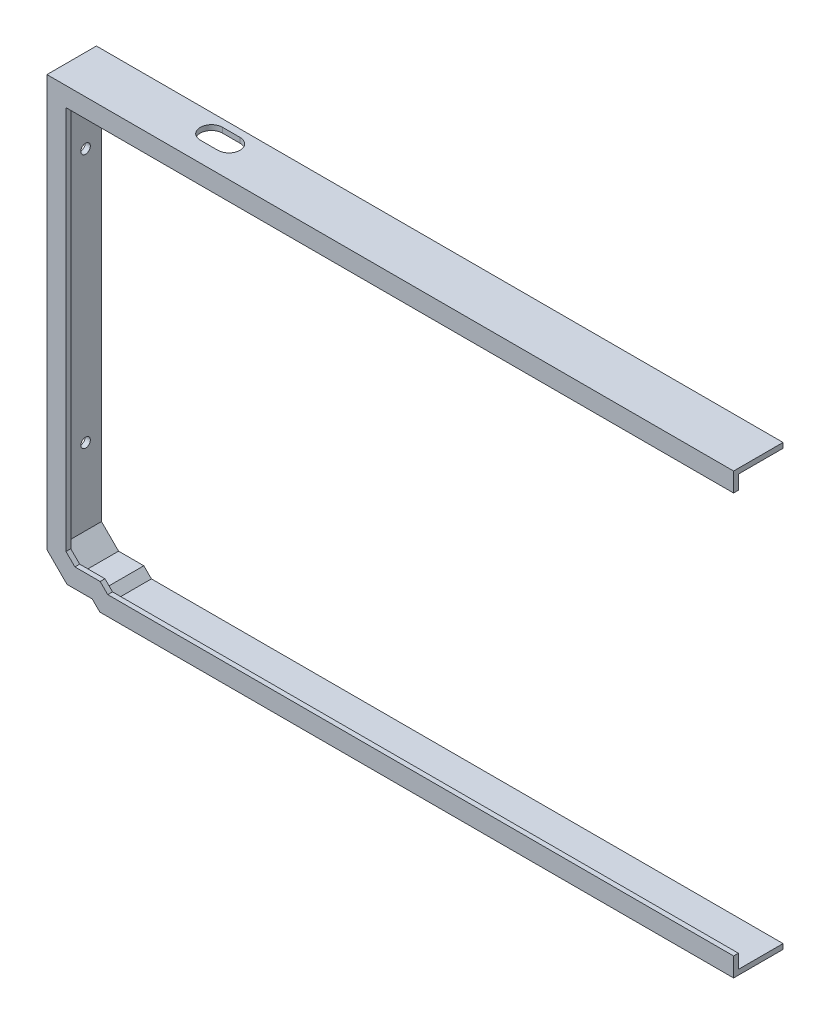
ISO-10303-21;
HEADER;
FILE_DESCRIPTION(('STEP AP214'),'2;1');
FILE_NAME('part.step','',(''),(''),'','','');
FILE_SCHEMA(('AUTOMOTIVE_DESIGN { 1 0 10303 214 1 1 1 1 }'));
ENDSEC;
DATA;
#1=APPLICATION_CONTEXT('core data for automotive mechanical design processes');
#2=APPLICATION_PROTOCOL_DEFINITION('international standard','automotive_design',2000,#1);
#3=PRODUCT_CONTEXT('',#1,'mechanical');
#4=PRODUCT('Part','Part','',(#3));
#5=PRODUCT_RELATED_PRODUCT_CATEGORY('part','',(#4));
#6=PRODUCT_DEFINITION_FORMATION('','',#4);
#7=PRODUCT_DEFINITION_CONTEXT('part definition',#1,'design');
#8=PRODUCT_DEFINITION('design','',#6,#7);
#9=PRODUCT_DEFINITION_SHAPE('','',#8);
#10=(LENGTH_UNIT() NAMED_UNIT(*) SI_UNIT(.MILLI.,.METRE.));
#11=(NAMED_UNIT(*) PLANE_ANGLE_UNIT() SI_UNIT($,.RADIAN.));
#12=(NAMED_UNIT(*) SI_UNIT($,.STERADIAN.) SOLID_ANGLE_UNIT());
#13=UNCERTAINTY_MEASURE_WITH_UNIT(LENGTH_MEASURE(1.E-05),#10,'distance_accuracy_value','');
#14=(GEOMETRIC_REPRESENTATION_CONTEXT(3) GLOBAL_UNCERTAINTY_ASSIGNED_CONTEXT((#13)) GLOBAL_UNIT_ASSIGNED_CONTEXT((#10,
#11,#12)) REPRESENTATION_CONTEXT('',''));
#15=CARTESIAN_POINT('',(0.,0.,0.));
#16=DIRECTION('',(0.,0.,1.));
#17=DIRECTION('',(1.,0.,0.));
#18=AXIS2_PLACEMENT_3D('',#15,#16,#17);
#19=CARTESIAN_POINT('',(-1.7,1.7,-14.05));
#20=DIRECTION('',(-1.,0.,0.));
#21=DIRECTION('',(0.,0.,1.));
#22=AXIS2_PLACEMENT_3D('',#19,#20,#21);
#23=PLANE('',#22);
#24=CARTESIAN_POINT('',(-1.7,-22.9620815280171,-9.05000000000001));
#25=DIRECTION('',(-1.,0.,0.));
#26=DIRECTION('',(0.,0.,1.));
#27=AXIS2_PLACEMENT_3D('',#24,#25,#26);
#28=CIRCLE('',#27,1.5);
#29=CARTESIAN_POINT('',(-1.7,-22.9620815280171,-7.55000000000001));
#30=VERTEX_POINT('',#29);
#31=EDGE_CURVE('E398',#30,#30,#28,.T.);
#32=ORIENTED_EDGE('',*,*,#31,.F.);
#33=EDGE_LOOP('',(#32));
#34=FACE_BOUND('',#33,.T.);
#35=CARTESIAN_POINT('',(-1.7,-102.962081528017,-9.05000000000001));
#36=DIRECTION('',(-1.,0.,0.));
#37=DIRECTION('',(0.,0.,1.));
#38=AXIS2_PLACEMENT_3D('',#35,#36,#37);
#39=CIRCLE('',#38,1.5);
#40=CARTESIAN_POINT('',(-1.7,-102.962081528017,-7.55000000000001));
#41=VERTEX_POINT('',#40);
#42=EDGE_CURVE('E399',#41,#41,#39,.T.);
#43=ORIENTED_EDGE('',*,*,#42,.F.);
#44=EDGE_LOOP('',(#43));
#45=FACE_BOUND('',#44,.T.);
#46=DIRECTION('',(0.,0.,1.));
#47=VECTOR('',#46,1.);
#48=CARTESIAN_POINT('',(-1.7,-127.624163056034,-14.05));
#49=LINE('',#48,#47);
#50=CARTESIAN_POINT('',(-1.7,-127.624163056034,-14.05));
#51=VERTEX_POINT('',#50);
#52=CARTESIAN_POINT('',(-1.7,-127.624163056034,1.5));
#53=VERTEX_POINT('',#52);
#54=EDGE_CURVE('E296',#51,#53,#49,.T.);
#55=ORIENTED_EDGE('',*,*,#54,.T.);
#56=DIRECTION('',(0.,-1.,0.));
#57=VECTOR('',#56,1.);
#58=CARTESIAN_POINT('',(-1.7,1.7,1.5));
#59=LINE('',#58,#57);
#60=CARTESIAN_POINT('',(-1.7,1.7,1.5));
#61=VERTEX_POINT('',#60);
#62=EDGE_CURVE('E308',#61,#53,#59,.T.);
#63=ORIENTED_EDGE('',*,*,#62,.F.);
#64=DIRECTION('',(0.,0.,1.));
#65=VECTOR('',#64,1.);
#66=CARTESIAN_POINT('',(-1.7,1.7,-14.05));
#67=LINE('',#66,#65);
#68=CARTESIAN_POINT('',(-1.7,1.7,-14.05));
#69=VERTEX_POINT('',#68);
#70=EDGE_CURVE('E46',#69,#61,#67,.T.);
#71=ORIENTED_EDGE('',*,*,#70,.F.);
#72=DIRECTION('',(0.,-1.,0.));
#73=VECTOR('',#72,1.);
#74=CARTESIAN_POINT('',(-1.7,1.7,-14.05));
#75=LINE('',#74,#73);
#76=EDGE_CURVE('E270',#69,#51,#75,.T.);
#77=ORIENTED_EDGE('',*,*,#76,.T.);
#78=EDGE_LOOP('',(#55,#63,#71,#77));
#79=FACE_BOUND('',#78,.T.);
#80=ADVANCED_FACE('F39',(#34,#45,#79),#23,.T.);
#81=CARTESIAN_POINT('',(-1.7,1.7,-14.05));
#82=DIRECTION('',(0.,1.,0.));
#83=DIRECTION('',(0.,0.,1.));
#84=AXIS2_PLACEMENT_3D('',#81,#82,#83);
#85=PLANE('',#84);
#86=DIRECTION('',(0.,0.,1.));
#87=VECTOR('',#86,1.);
#88=CARTESIAN_POINT('',(214.14,1.7,1.5));
#89=LINE('',#88,#87);
#90=CARTESIAN_POINT('',(214.14,1.7,-14.05));
#91=VERTEX_POINT('',#90);
#92=CARTESIAN_POINT('',(214.14,1.7,1.5));
#93=VERTEX_POINT('',#92);
#94=EDGE_CURVE('E220',#91,#93,#89,.T.);
#95=ORIENTED_EDGE('',*,*,#94,.F.);
#96=DIRECTION('',(-1.,0.,0.));
#97=VECTOR('',#96,1.);
#98=CARTESIAN_POINT('',(-1.7,1.7,-14.05));
#99=LINE('',#98,#97);
#100=EDGE_CURVE('E294',#91,#69,#99,.T.);
#101=ORIENTED_EDGE('',*,*,#100,.T.);
#102=ORIENTED_EDGE('',*,*,#70,.T.);
#103=DIRECTION('',(-1.,0.,0.));
#104=VECTOR('',#103,1.);
#105=CARTESIAN_POINT('',(429.98,1.7,1.5));
#106=LINE('',#105,#104);
#107=EDGE_CURVE('E317',#93,#61,#106,.T.);
#108=ORIENTED_EDGE('',*,*,#107,.F.);
#109=EDGE_LOOP('',(#95,#101,#102,#108));
#110=FACE_BOUND('',#109,.T.);
#111=CARTESIAN_POINT('',(45.76,1.7,-8.25));
#112=DIRECTION('',(0.,1.,0.));
#113=DIRECTION('',(0.,0.,1.));
#114=AXIS2_PLACEMENT_3D('',#111,#112,#113);
#115=CIRCLE('',#114,3.5);
#116=CARTESIAN_POINT('',(45.76,1.7,-4.75));
#117=VERTEX_POINT('',#116);
#118=CARTESIAN_POINT('',(45.76,1.7,-11.75));
#119=VERTEX_POINT('',#118);
#120=EDGE_CURVE('E385',#117,#119,#115,.T.);
#121=ORIENTED_EDGE('',*,*,#120,.F.);
#122=DIRECTION('',(1.,0.,0.));
#123=VECTOR('',#122,1.);
#124=CARTESIAN_POINT('',(45.76,1.7,-4.75));
#125=LINE('',#124,#123);
#126=CARTESIAN_POINT('',(40.26,1.7,-4.75));
#127=VERTEX_POINT('',#126);
#128=EDGE_CURVE('E370',#127,#117,#125,.T.);
#129=ORIENTED_EDGE('',*,*,#128,.F.);
#130=CARTESIAN_POINT('',(40.26,1.7,-8.25));
#131=DIRECTION('',(0.,1.,0.));
#132=DIRECTION('',(0.,0.,1.));
#133=AXIS2_PLACEMENT_3D('',#130,#131,#132);
#134=CIRCLE('',#133,3.5);
#135=CARTESIAN_POINT('',(40.26,1.7,-11.75));
#136=VERTEX_POINT('',#135);
#137=EDGE_CURVE('E379',#136,#127,#134,.T.);
#138=ORIENTED_EDGE('',*,*,#137,.F.);
#139=DIRECTION('',(-1.,0.,0.));
#140=VECTOR('',#139,1.);
#141=CARTESIAN_POINT('',(45.76,1.7,-11.75));
#142=LINE('',#141,#140);
#143=EDGE_CURVE('E382',#119,#136,#142,.T.);
#144=ORIENTED_EDGE('',*,*,#143,.F.);
#145=EDGE_LOOP('',(#121,#129,#138,#144));
#146=FACE_BOUND('',#145,.T.);
#147=ADVANCED_FACE('F423',(#110,#146),#85,.T.);
#148=CARTESIAN_POINT('',(413.350841276725,-136.31332177931,-14.05));
#149=DIRECTION('',(0.,-1.,0.));
#150=DIRECTION('',(0.,0.,-1.));
#151=AXIS2_PLACEMENT_3D('',#148,#149,#150);
#152=PLANE('',#151);
#153=DIRECTION('',(0.,0.,1.));
#154=VECTOR('',#153,1.);
#155=CARTESIAN_POINT('',(214.14,-136.31332177931,1.5));
#156=LINE('',#155,#154);
#157=CARTESIAN_POINT('',(214.14,-136.31332177931,-14.05));
#158=VERTEX_POINT('',#157);
#159=CARTESIAN_POINT('',(214.14,-136.31332177931,1.5));
#160=VERTEX_POINT('',#159);
#161=EDGE_CURVE('E205',#158,#160,#156,.T.);
#162=ORIENTED_EDGE('',*,*,#161,.T.);
#163=DIRECTION('',(1.,0.,0.));
#164=VECTOR('',#163,1.);
#165=CARTESIAN_POINT('',(14.9291587232754,-136.31332177931,1.5));
#166=LINE('',#165,#164);
#167=CARTESIAN_POINT('',(14.9291587232754,-136.31332177931,1.5));
#168=VERTEX_POINT('',#167);
#169=EDGE_CURVE('E217',#168,#160,#166,.T.);
#170=ORIENTED_EDGE('',*,*,#169,.F.);
#171=DIRECTION('',(0.,0.,1.));
#172=VECTOR('',#171,1.);
#173=CARTESIAN_POINT('',(14.9291587232754,-136.31332177931,-14.05));
#174=LINE('',#173,#172);
#175=CARTESIAN_POINT('',(14.9291587232754,-136.31332177931,-14.05));
#176=VERTEX_POINT('',#175);
#177=EDGE_CURVE('E299',#176,#168,#174,.T.);
#178=ORIENTED_EDGE('',*,*,#177,.F.);
#179=DIRECTION('',(1.,0.,0.));
#180=VECTOR('',#179,1.);
#181=CARTESIAN_POINT('',(413.350841276725,-136.31332177931,-14.05));
#182=LINE('',#181,#180);
#183=EDGE_CURVE('E219',#176,#158,#182,.T.);
#184=ORIENTED_EDGE('',*,*,#183,.T.);
#185=EDGE_LOOP('',(#162,#170,#178,#184));
#186=FACE_BOUND('',#185,.T.);
#187=ADVANCED_FACE('F216',(#186),#152,.T.);
#188=CARTESIAN_POINT('',(12.5462088706767,-133.930371926711,-14.05));
#189=DIRECTION('',(-0.707106781186547,-0.707106781186547,0.));
#190=DIRECTION('',(0.707106781186548,-0.707106781186548,0.));
#191=AXIS2_PLACEMENT_3D('',#188,#189,#190);
#192=PLANE('',#191);
#193=ORIENTED_EDGE('',*,*,#177,.T.);
#194=DIRECTION('',(0.707106781186547,-0.707106781186547,0.));
#195=VECTOR('',#194,1.);
#196=CARTESIAN_POINT('',(12.5462088706767,-133.930371926711,1.5));
#197=LINE('',#196,#195);
#198=CARTESIAN_POINT('',(12.5462088706767,-133.930371926711,1.5));
#199=VERTEX_POINT('',#198);
#200=EDGE_CURVE('E226',#199,#168,#197,.T.);
#201=ORIENTED_EDGE('',*,*,#200,.F.);
#202=DIRECTION('',(0.,0.,1.));
#203=VECTOR('',#202,1.);
#204=CARTESIAN_POINT('',(12.5462088706767,-133.930371926711,-14.05));
#205=LINE('',#204,#203);
#206=CARTESIAN_POINT('',(12.5462088706767,-133.930371926711,-14.05));
#207=VERTEX_POINT('',#206);
#208=EDGE_CURVE('E301',#207,#199,#205,.T.);
#209=ORIENTED_EDGE('',*,*,#208,.F.);
#210=DIRECTION('',(0.707106781186547,-0.707106781186547,0.));
#211=VECTOR('',#210,1.);
#212=CARTESIAN_POINT('',(12.5462088706767,-133.930371926711,-14.05));
#213=LINE('',#212,#211);
#214=EDGE_CURVE('E290',#207,#176,#213,.T.);
#215=ORIENTED_EDGE('',*,*,#214,.T.);
#216=EDGE_LOOP('',(#193,#201,#209,#215));
#217=FACE_BOUND('',#216,.T.);
#218=ADVANCED_FACE('F432',(#217),#192,.T.);
#219=CARTESIAN_POINT('',(4.60620887067671,-133.930371926711,-14.05));
#220=DIRECTION('',(0.,-1.,0.));
#221=DIRECTION('',(0.,0.,-1.));
#222=AXIS2_PLACEMENT_3D('',#219,#220,#221);
#223=PLANE('',#222);
#224=ORIENTED_EDGE('',*,*,#208,.T.);
#225=DIRECTION('',(1.,0.,0.));
#226=VECTOR('',#225,1.);
#227=CARTESIAN_POINT('',(4.60620887067671,-133.930371926711,1.5));
#228=LINE('',#227,#226);
#229=CARTESIAN_POINT('',(4.60620887067671,-133.930371926711,1.5));
#230=VERTEX_POINT('',#229);
#231=EDGE_CURVE('E232',#230,#199,#228,.T.);
#232=ORIENTED_EDGE('',*,*,#231,.F.);
#233=DIRECTION('',(0.,0.,1.));
#234=VECTOR('',#233,1.);
#235=CARTESIAN_POINT('',(4.60620887067671,-133.930371926711,-14.05));
#236=LINE('',#235,#234);
#237=CARTESIAN_POINT('',(4.60620887067671,-133.930371926711,-14.05));
#238=VERTEX_POINT('',#237);
#239=EDGE_CURVE('E303',#238,#230,#236,.T.);
#240=ORIENTED_EDGE('',*,*,#239,.F.);
#241=DIRECTION('',(1.,0.,0.));
#242=VECTOR('',#241,1.);
#243=CARTESIAN_POINT('',(4.60620887067671,-133.930371926711,-14.05));
#244=LINE('',#243,#242);
#245=EDGE_CURVE('E287',#238,#207,#244,.T.);
#246=ORIENTED_EDGE('',*,*,#245,.T.);
#247=EDGE_LOOP('',(#224,#232,#240,#246));
#248=FACE_BOUND('',#247,.T.);
#249=ADVANCED_FACE('F430',(#248),#223,.T.);
#250=CARTESIAN_POINT('',(-1.7,-127.624163056034,-14.05));
#251=DIRECTION('',(-0.707106781186547,-0.707106781186548,0.));
#252=DIRECTION('',(0.707106781186548,-0.707106781186547,0.));
#253=AXIS2_PLACEMENT_3D('',#250,#251,#252);
#254=PLANE('',#253);
#255=ORIENTED_EDGE('',*,*,#239,.T.);
#256=DIRECTION('',(0.707106781186548,-0.707106781186547,0.));
#257=VECTOR('',#256,1.);
#258=CARTESIAN_POINT('',(-1.7,-127.624163056034,1.5));
#259=LINE('',#258,#257);
#260=EDGE_CURVE('E314',#53,#230,#259,.T.);
#261=ORIENTED_EDGE('',*,*,#260,.F.);
#262=ORIENTED_EDGE('',*,*,#54,.F.);
#263=DIRECTION('',(0.707106781186548,-0.707106781186547,0.));
#264=VECTOR('',#263,1.);
#265=CARTESIAN_POINT('',(-1.7,-127.624163056034,-14.05));
#266=LINE('',#265,#264);
#267=EDGE_CURVE('E284',#51,#238,#266,.T.);
#268=ORIENTED_EDGE('',*,*,#267,.T.);
#269=EDGE_LOOP('',(#255,#261,#262,#268));
#270=FACE_BOUND('',#269,.T.);
#271=ADVANCED_FACE('F319',(#270),#254,.T.);
#272=CARTESIAN_POINT('',(0.,0.,-14.05));
#273=DIRECTION('',(0.,0.,1.));
#274=DIRECTION('',(1.,0.,0.));
#275=AXIS2_PLACEMENT_3D('',#272,#273,#274);
#276=PLANE('',#275);
#277=ORIENTED_EDGE('',*,*,#100,.F.);
#278=DIRECTION('',(0.,1.,0.));
#279=VECTOR('',#278,1.);
#280=CARTESIAN_POINT('',(214.14,-136.31332177931,-14.05));
#281=LINE('',#280,#279);
#282=CARTESIAN_POINT('',(214.14,0.099999999999989,-14.05));
#283=VERTEX_POINT('',#282);
#284=EDGE_CURVE('E211',#283,#91,#281,.T.);
#285=ORIENTED_EDGE('',*,*,#284,.F.);
#286=DIRECTION('',(-1.,0.,0.));
#287=VECTOR('',#286,1.);
#288=CARTESIAN_POINT('',(-0.1,0.1,-14.05));
#289=LINE('',#288,#287);
#290=CARTESIAN_POINT('',(-0.1,0.1,-14.05));
#291=VERTEX_POINT('',#290);
#292=EDGE_CURVE('E252',#283,#291,#289,.T.);
#293=ORIENTED_EDGE('',*,*,#292,.T.);
#294=DIRECTION('',(0.,-1.,0.));
#295=VECTOR('',#294,1.);
#296=CARTESIAN_POINT('',(-0.1,0.1,-14.05));
#297=LINE('',#296,#295);
#298=CARTESIAN_POINT('',(-0.1,-126.961421356237,-14.05));
#299=VERTEX_POINT('',#298);
#300=EDGE_CURVE('E236',#291,#299,#297,.T.);
#301=ORIENTED_EDGE('',*,*,#300,.T.);
#302=DIRECTION('',(0.707106781186547,-0.707106781186548,0.));
#303=VECTOR('',#302,1.);
#304=CARTESIAN_POINT('',(-0.1,-126.961421356237,-14.05));
#305=LINE('',#304,#303);
#306=CARTESIAN_POINT('',(5.26895057047365,-132.330371926711,-14.05));
#307=VERTEX_POINT('',#306);
#308=EDGE_CURVE('E239',#299,#307,#305,.T.);
#309=ORIENTED_EDGE('',*,*,#308,.T.);
#310=DIRECTION('',(1.,0.,0.));
#311=VECTOR('',#310,1.);
#312=CARTESIAN_POINT('',(5.26895057047367,-132.330371926711,-14.05));
#313=LINE('',#312,#311);
#314=CARTESIAN_POINT('',(13.2089505704737,-132.330371926711,-14.05));
#315=VERTEX_POINT('',#314);
#316=EDGE_CURVE('E243',#307,#315,#313,.T.);
#317=ORIENTED_EDGE('',*,*,#316,.T.);
#318=DIRECTION('',(0.707106781186547,-0.707106781186547,0.));
#319=VECTOR('',#318,1.);
#320=CARTESIAN_POINT('',(13.2089505704737,-132.330371926711,-14.05));
#321=LINE('',#320,#319);
#322=CARTESIAN_POINT('',(15.5919004230724,-134.71332177931,-14.05));
#323=VERTEX_POINT('',#322);
#324=EDGE_CURVE('E246',#315,#323,#321,.T.);
#325=ORIENTED_EDGE('',*,*,#324,.T.);
#326=DIRECTION('',(1.,0.,0.));
#327=VECTOR('',#326,1.);
#328=CARTESIAN_POINT('',(412.688099576928,-134.71332177931,-14.05));
#329=LINE('',#328,#327);
#330=CARTESIAN_POINT('',(214.14,-134.71332177931,-14.05));
#331=VERTEX_POINT('',#330);
#332=EDGE_CURVE('E249',#323,#331,#329,.T.);
#333=ORIENTED_EDGE('',*,*,#332,.T.);
#334=EDGE_CURVE('E413',#158,#331,#281,.T.);
#335=ORIENTED_EDGE('',*,*,#334,.F.);
#336=ORIENTED_EDGE('',*,*,#183,.F.);
#337=ORIENTED_EDGE('',*,*,#214,.F.);
#338=ORIENTED_EDGE('',*,*,#245,.F.);
#339=ORIENTED_EDGE('',*,*,#267,.F.);
#340=ORIENTED_EDGE('',*,*,#76,.F.);
#341=EDGE_LOOP('',(#277,#285,#293,#301,#309,#317,#325,#333,#335,#336,#337,#338,#339,#340));
#342=FACE_BOUND('',#341,.T.);
#343=ADVANCED_FACE('F426',(#342),#276,.F.);
#344=CARTESIAN_POINT('',(-0.1,0.1,-14.05));
#345=DIRECTION('',(-1.,0.,0.));
#346=DIRECTION('',(0.,0.,1.));
#347=AXIS2_PLACEMENT_3D('',#344,#345,#346);
#348=PLANE('',#347);
#349=CARTESIAN_POINT('',(-0.099999999999989,-22.9620815280171,-9.05000000000001));
#350=DIRECTION('',(-1.,0.,0.));
#351=DIRECTION('',(0.,0.,1.));
#352=AXIS2_PLACEMENT_3D('',#349,#350,#351);
#353=CIRCLE('',#352,1.5);
#354=CARTESIAN_POINT('',(-0.099999999999989,-22.9620815280171,-7.55000000000001));
#355=VERTEX_POINT('',#354);
#356=EDGE_CURVE('E387',#355,#355,#353,.T.);
#357=ORIENTED_EDGE('',*,*,#356,.T.);
#358=EDGE_LOOP('',(#357));
#359=FACE_BOUND('',#358,.T.);
#360=CARTESIAN_POINT('',(-0.099999999999989,-102.962081528017,-9.05000000000001));
#361=DIRECTION('',(-1.,0.,0.));
#362=DIRECTION('',(0.,0.,1.));
#363=AXIS2_PLACEMENT_3D('',#360,#361,#362);
#364=CIRCLE('',#363,1.5);
#365=CARTESIAN_POINT('',(-0.099999999999989,-102.962081528017,-7.55000000000001));
#366=VERTEX_POINT('',#365);
#367=EDGE_CURVE('E395',#366,#366,#364,.T.);
#368=ORIENTED_EDGE('',*,*,#367,.T.);
#369=EDGE_LOOP('',(#368));
#370=FACE_BOUND('',#369,.T.);
#371=DIRECTION('',(0.,-1.,0.));
#372=VECTOR('',#371,1.);
#373=CARTESIAN_POINT('',(-0.1,0.1,0.));
#374=LINE('',#373,#372);
#375=CARTESIAN_POINT('',(-0.1,0.1,0.));
#376=VERTEX_POINT('',#375);
#377=CARTESIAN_POINT('',(-0.100000000000003,-126.961421356237,0.));
#378=VERTEX_POINT('',#377);
#379=EDGE_CURVE('E227',#376,#378,#374,.T.);
#380=ORIENTED_EDGE('',*,*,#379,.T.);
#381=DIRECTION('',(0.,0.,1.));
#382=VECTOR('',#381,1.);
#383=CARTESIAN_POINT('',(-0.1,-126.961421356237,-14.05));
#384=LINE('',#383,#382);
#385=EDGE_CURVE('E253',#299,#378,#384,.T.);
#386=ORIENTED_EDGE('',*,*,#385,.F.);
#387=ORIENTED_EDGE('',*,*,#300,.F.);
#388=DIRECTION('',(0.,0.,1.));
#389=VECTOR('',#388,1.);
#390=CARTESIAN_POINT('',(-0.1,0.1,-14.05));
#391=LINE('',#390,#389);
#392=EDGE_CURVE('E267',#291,#376,#391,.T.);
#393=ORIENTED_EDGE('',*,*,#392,.T.);
#394=EDGE_LOOP('',(#380,#386,#387,#393));
#395=FACE_BOUND('',#394,.T.);
#396=ADVANCED_FACE('F474',(#359,#370,#395),#348,.F.);
#397=CARTESIAN_POINT('',(-0.1,0.1,-14.05));
#398=DIRECTION('',(0.,1.,0.));
#399=DIRECTION('',(0.,0.,1.));
#400=AXIS2_PLACEMENT_3D('',#397,#398,#399);
#401=PLANE('',#400);
#402=DIRECTION('',(-1.,0.,0.));
#403=VECTOR('',#402,1.);
#404=CARTESIAN_POINT('',(45.76,0.0999999999999994,-4.75));
#405=LINE('',#404,#403);
#406=CARTESIAN_POINT('',(45.76,0.0999999999999994,-4.75));
#407=VERTEX_POINT('',#406);
#408=CARTESIAN_POINT('',(40.26,0.0999999999999994,-4.75));
#409=VERTEX_POINT('',#408);
#410=EDGE_CURVE('E389',#407,#409,#405,.T.);
#411=ORIENTED_EDGE('',*,*,#410,.F.);
#412=CARTESIAN_POINT('',(45.76,0.0999999999999994,-8.25));
#413=DIRECTION('',(0.,1.,0.));
#414=DIRECTION('',(0.,0.,1.));
#415=AXIS2_PLACEMENT_3D('',#412,#413,#414);
#416=CIRCLE('',#415,3.5);
#417=CARTESIAN_POINT('',(45.76,0.0999999999999994,-11.75));
#418=VERTEX_POINT('',#417);
#419=EDGE_CURVE('E365',#418,#407,#416,.F.);
#420=ORIENTED_EDGE('',*,*,#419,.F.);
#421=DIRECTION('',(1.,0.,0.));
#422=VECTOR('',#421,1.);
#423=CARTESIAN_POINT('',(45.76,0.0999999999999994,-11.75));
#424=LINE('',#423,#422);
#425=CARTESIAN_POINT('',(40.26,0.1,-11.75));
#426=VERTEX_POINT('',#425);
#427=EDGE_CURVE('E353',#426,#418,#424,.T.);
#428=ORIENTED_EDGE('',*,*,#427,.F.);
#429=CARTESIAN_POINT('',(40.26,0.0999999999999994,-8.25));
#430=DIRECTION('',(0.,1.,0.));
#431=DIRECTION('',(0.,0.,1.));
#432=AXIS2_PLACEMENT_3D('',#429,#430,#431);
#433=CIRCLE('',#432,3.5);
#434=EDGE_CURVE('E376',#409,#426,#433,.F.);
#435=ORIENTED_EDGE('',*,*,#434,.F.);
#436=EDGE_LOOP('',(#411,#420,#428,#435));
#437=FACE_BOUND('',#436,.T.);
#438=ORIENTED_EDGE('',*,*,#292,.F.);
#439=DIRECTION('',(0.,0.,1.));
#440=VECTOR('',#439,1.);
#441=CARTESIAN_POINT('',(214.14,0.1,-14.05));
#442=LINE('',#441,#440);
#443=CARTESIAN_POINT('',(214.14,0.1,0.));
#444=VERTEX_POINT('',#443);
#445=EDGE_CURVE('E402',#283,#444,#442,.T.);
#446=ORIENTED_EDGE('',*,*,#445,.T.);
#447=DIRECTION('',(-1.,0.,0.));
#448=VECTOR('',#447,1.);
#449=CARTESIAN_POINT('',(-0.1,0.1,0.));
#450=LINE('',#449,#448);
#451=EDGE_CURVE('E240',#444,#376,#450,.T.);
#452=ORIENTED_EDGE('',*,*,#451,.T.);
#453=ORIENTED_EDGE('',*,*,#392,.F.);
#454=EDGE_LOOP('',(#438,#446,#452,#453));
#455=FACE_BOUND('',#454,.T.);
#456=ADVANCED_FACE('F470',(#437,#455),#401,.F.);
#457=CARTESIAN_POINT('',(412.688099576928,-134.71332177931,-14.05));
#458=DIRECTION('',(0.,-1.,0.));
#459=DIRECTION('',(0.,0.,-1.));
#460=AXIS2_PLACEMENT_3D('',#457,#458,#459);
#461=PLANE('',#460);
#462=DIRECTION('',(1.,0.,0.));
#463=VECTOR('',#462,1.);
#464=CARTESIAN_POINT('',(412.688099576928,-134.71332177931,0.));
#465=LINE('',#464,#463);
#466=CARTESIAN_POINT('',(15.5919004230724,-134.71332177931,0.));
#467=VERTEX_POINT('',#466);
#468=CARTESIAN_POINT('',(214.14,-134.71332177931,0.));
#469=VERTEX_POINT('',#468);
#470=EDGE_CURVE('E263',#467,#469,#465,.T.);
#471=ORIENTED_EDGE('',*,*,#470,.T.);
#472=DIRECTION('',(0.,0.,-1.));
#473=VECTOR('',#472,1.);
#474=CARTESIAN_POINT('',(214.14,-134.71332177931,-14.05));
#475=LINE('',#474,#473);
#476=EDGE_CURVE('E410',#469,#331,#475,.T.);
#477=ORIENTED_EDGE('',*,*,#476,.T.);
#478=ORIENTED_EDGE('',*,*,#332,.F.);
#479=DIRECTION('',(0.,0.,1.));
#480=VECTOR('',#479,1.);
#481=CARTESIAN_POINT('',(15.5919004230724,-134.71332177931,-14.05));
#482=LINE('',#481,#480);
#483=EDGE_CURVE('E271',#323,#467,#482,.T.);
#484=ORIENTED_EDGE('',*,*,#483,.T.);
#485=EDGE_LOOP('',(#471,#477,#478,#484));
#486=FACE_BOUND('',#485,.T.);
#487=ADVANCED_FACE('F435',(#486),#461,.F.);
#488=CARTESIAN_POINT('',(13.2089505704737,-132.330371926711,-14.05));
#489=DIRECTION('',(-0.707106781186547,-0.707106781186547,0.));
#490=DIRECTION('',(0.707106781186548,-0.707106781186548,0.));
#491=AXIS2_PLACEMENT_3D('',#488,#489,#490);
#492=PLANE('',#491);
#493=DIRECTION('',(0.707106781186547,-0.707106781186547,0.));
#494=VECTOR('',#493,1.);
#495=CARTESIAN_POINT('',(13.2089505704737,-132.330371926711,0.));
#496=LINE('',#495,#494);
#497=CARTESIAN_POINT('',(13.2089505704737,-132.330371926711,0.));
#498=VERTEX_POINT('',#497);
#499=EDGE_CURVE('E260',#498,#467,#496,.T.);
#500=ORIENTED_EDGE('',*,*,#499,.T.);
#501=ORIENTED_EDGE('',*,*,#483,.F.);
#502=ORIENTED_EDGE('',*,*,#324,.F.);
#503=DIRECTION('',(0.,0.,1.));
#504=VECTOR('',#503,1.);
#505=CARTESIAN_POINT('',(13.2089505704737,-132.330371926711,-14.05));
#506=LINE('',#505,#504);
#507=EDGE_CURVE('E274',#315,#498,#506,.T.);
#508=ORIENTED_EDGE('',*,*,#507,.T.);
#509=EDGE_LOOP('',(#500,#501,#502,#508));
#510=FACE_BOUND('',#509,.T.);
#511=ADVANCED_FACE('F482',(#510),#492,.F.);
#512=CARTESIAN_POINT('',(5.26895057047367,-132.330371926711,-14.05));
#513=DIRECTION('',(0.,-1.,0.));
#514=DIRECTION('',(0.,0.,-1.));
#515=AXIS2_PLACEMENT_3D('',#512,#513,#514);
#516=PLANE('',#515);
#517=DIRECTION('',(1.,0.,0.));
#518=VECTOR('',#517,1.);
#519=CARTESIAN_POINT('',(5.26895057047367,-132.330371926711,0.));
#520=LINE('',#519,#518);
#521=CARTESIAN_POINT('',(5.26895057047367,-132.330371926711,0.));
#522=VERTEX_POINT('',#521);
#523=EDGE_CURVE('E257',#522,#498,#520,.T.);
#524=ORIENTED_EDGE('',*,*,#523,.T.);
#525=ORIENTED_EDGE('',*,*,#507,.F.);
#526=ORIENTED_EDGE('',*,*,#316,.F.);
#527=DIRECTION('',(0.,0.,1.));
#528=VECTOR('',#527,1.);
#529=CARTESIAN_POINT('',(5.26895057047367,-132.330371926711,-14.05));
#530=LINE('',#529,#528);
#531=EDGE_CURVE('E277',#307,#522,#530,.T.);
#532=ORIENTED_EDGE('',*,*,#531,.T.);
#533=EDGE_LOOP('',(#524,#525,#526,#532));
#534=FACE_BOUND('',#533,.T.);
#535=ADVANCED_FACE('F479',(#534),#516,.F.);
#536=CARTESIAN_POINT('',(-0.1,-126.961421356237,-14.05));
#537=DIRECTION('',(-0.707106781186548,-0.707106781186547,0.));
#538=DIRECTION('',(0.707106781186547,-0.707106781186548,0.));
#539=AXIS2_PLACEMENT_3D('',#536,#537,#538);
#540=PLANE('',#539);
#541=DIRECTION('',(0.707106781186547,-0.707106781186548,0.));
#542=VECTOR('',#541,1.);
#543=CARTESIAN_POINT('',(-0.1,-126.961421356237,0.));
#544=LINE('',#543,#542);
#545=EDGE_CURVE('E230',#378,#522,#544,.T.);
#546=ORIENTED_EDGE('',*,*,#545,.T.);
#547=ORIENTED_EDGE('',*,*,#531,.F.);
#548=ORIENTED_EDGE('',*,*,#308,.F.);
#549=ORIENTED_EDGE('',*,*,#385,.T.);
#550=EDGE_LOOP('',(#546,#547,#548,#549));
#551=FACE_BOUND('',#550,.T.);
#552=ADVANCED_FACE('F477',(#551),#540,.F.);
#553=CARTESIAN_POINT('',(0.,0.,1.5));
#554=DIRECTION('',(0.,0.,1.));
#555=DIRECTION('',(1.,0.,0.));
#556=AXIS2_PLACEMENT_3D('',#553,#554,#555);
#557=PLANE('',#556);
#558=DIRECTION('',(0.,1.,0.));
#559=VECTOR('',#558,1.);
#560=CARTESIAN_POINT('',(214.14,-136.31332177931,1.5));
#561=LINE('',#560,#559);
#562=CARTESIAN_POINT('',(214.14,-4.3,1.5));
#563=VERTEX_POINT('',#562);
#564=EDGE_CURVE('E53',#563,#93,#561,.T.);
#565=ORIENTED_EDGE('',*,*,#564,.T.);
#566=ORIENTED_EDGE('',*,*,#107,.T.);
#567=ORIENTED_EDGE('',*,*,#62,.T.);
#568=ORIENTED_EDGE('',*,*,#260,.T.);
#569=ORIENTED_EDGE('',*,*,#231,.T.);
#570=ORIENTED_EDGE('',*,*,#200,.T.);
#571=ORIENTED_EDGE('',*,*,#169,.T.);
#572=CARTESIAN_POINT('',(214.14,-130.31332177931,1.5));
#573=VERTEX_POINT('',#572);
#574=EDGE_CURVE('E202',#160,#573,#561,.T.);
#575=ORIENTED_EDGE('',*,*,#574,.T.);
#576=DIRECTION('',(1.,0.,0.));
#577=VECTOR('',#576,1.);
#578=CARTESIAN_POINT('',(17.414440097514,-130.31332177931,1.5));
#579=LINE('',#578,#577);
#580=CARTESIAN_POINT('',(17.414440097514,-130.31332177931,1.5));
#581=VERTEX_POINT('',#580);
#582=EDGE_CURVE('E334',#581,#573,#579,.T.);
#583=ORIENTED_EDGE('',*,*,#582,.F.);
#584=DIRECTION('',(0.707106781186547,-0.707106781186547,0.));
#585=VECTOR('',#584,1.);
#586=CARTESIAN_POINT('',(15.0314902449153,-127.930371926711,1.5));
#587=LINE('',#586,#585);
#588=CARTESIAN_POINT('',(15.0314902449153,-127.930371926711,1.5));
#589=VERTEX_POINT('',#588);
#590=EDGE_CURVE('E355',#589,#581,#587,.T.);
#591=ORIENTED_EDGE('',*,*,#590,.F.);
#592=DIRECTION('',(1.,0.,0.));
#593=VECTOR('',#592,1.);
#594=CARTESIAN_POINT('',(7.09149024491527,-127.930371926711,1.5));
#595=LINE('',#594,#593);
#596=CARTESIAN_POINT('',(7.09149024491527,-127.930371926711,1.5));
#597=VERTEX_POINT('',#596);
#598=EDGE_CURVE('E357',#597,#589,#595,.T.);
#599=ORIENTED_EDGE('',*,*,#598,.F.);
#600=DIRECTION('',(0.707106781186548,-0.707106781186547,0.));
#601=VECTOR('',#600,1.);
#602=CARTESIAN_POINT('',(4.3,-125.138881681796,1.5));
#603=LINE('',#602,#601);
#604=CARTESIAN_POINT('',(4.3,-125.138881681796,1.5));
#605=VERTEX_POINT('',#604);
#606=EDGE_CURVE('E359',#605,#597,#603,.T.);
#607=ORIENTED_EDGE('',*,*,#606,.F.);
#608=DIRECTION('',(0.,-1.,0.));
#609=VECTOR('',#608,1.);
#610=CARTESIAN_POINT('',(4.3,-4.3,1.5));
#611=LINE('',#610,#609);
#612=CARTESIAN_POINT('',(4.3,-4.3,1.5));
#613=VERTEX_POINT('',#612);
#614=EDGE_CURVE('E361',#613,#605,#611,.T.);
#615=ORIENTED_EDGE('',*,*,#614,.F.);
#616=DIRECTION('',(-1.,0.,0.));
#617=VECTOR('',#616,1.);
#618=CARTESIAN_POINT('',(423.98,-4.3,1.5));
#619=LINE('',#618,#617);
#620=EDGE_CURVE('E338',#563,#613,#619,.T.);
#621=ORIENTED_EDGE('',*,*,#620,.F.);
#622=EDGE_LOOP('',(#565,#566,#567,#568,#569,#570,#571,#575,#583,#591,#599,#607,#615,#621));
#623=FACE_BOUND('',#622,.T.);
#624=ADVANCED_FACE('F223',(#623),#557,.T.);
#625=CARTESIAN_POINT('',(0.,0.,0.));
#626=DIRECTION('',(0.,0.,1.));
#627=DIRECTION('',(1.,0.,0.));
#628=AXIS2_PLACEMENT_3D('',#625,#626,#627);
#629=PLANE('',#628);
#630=ORIENTED_EDGE('',*,*,#451,.F.);
#631=DIRECTION('',(0.,-1.,0.));
#632=VECTOR('',#631,1.);
#633=CARTESIAN_POINT('',(214.14,0.,0.));
#634=LINE('',#633,#632);
#635=CARTESIAN_POINT('',(214.14,-4.3,0.));
#636=VERTEX_POINT('',#635);
#637=EDGE_CURVE('E407',#444,#636,#634,.T.);
#638=ORIENTED_EDGE('',*,*,#637,.T.);
#639=DIRECTION('',(-1.,0.,0.));
#640=VECTOR('',#639,1.);
#641=CARTESIAN_POINT('',(423.98,-4.3,0.));
#642=LINE('',#641,#640);
#643=CARTESIAN_POINT('',(4.3,-4.3,0.));
#644=VERTEX_POINT('',#643);
#645=EDGE_CURVE('E351',#636,#644,#642,.T.);
#646=ORIENTED_EDGE('',*,*,#645,.T.);
#647=DIRECTION('',(0.,-1.,0.));
#648=VECTOR('',#647,1.);
#649=CARTESIAN_POINT('',(4.3,-4.3,0.));
#650=LINE('',#649,#648);
#651=CARTESIAN_POINT('',(4.3,-125.138881681796,0.));
#652=VERTEX_POINT('',#651);
#653=EDGE_CURVE('E348',#644,#652,#650,.T.);
#654=ORIENTED_EDGE('',*,*,#653,.T.);
#655=DIRECTION('',(0.707106781186548,-0.707106781186547,0.));
#656=VECTOR('',#655,1.);
#657=CARTESIAN_POINT('',(4.3,-125.138881681796,0.));
#658=LINE('',#657,#656);
#659=CARTESIAN_POINT('',(7.09149024491527,-127.930371926711,0.));
#660=VERTEX_POINT('',#659);
#661=EDGE_CURVE('E345',#652,#660,#658,.T.);
#662=ORIENTED_EDGE('',*,*,#661,.T.);
#663=DIRECTION('',(1.,0.,0.));
#664=VECTOR('',#663,1.);
#665=CARTESIAN_POINT('',(7.09149024491527,-127.930371926711,0.));
#666=LINE('',#665,#664);
#667=CARTESIAN_POINT('',(15.0314902449153,-127.930371926711,0.));
#668=VERTEX_POINT('',#667);
#669=EDGE_CURVE('E342',#660,#668,#666,.T.);
#670=ORIENTED_EDGE('',*,*,#669,.T.);
#671=DIRECTION('',(0.707106781186547,-0.707106781186547,0.));
#672=VECTOR('',#671,1.);
#673=CARTESIAN_POINT('',(15.0314902449153,-127.930371926711,0.));
#674=LINE('',#673,#672);
#675=CARTESIAN_POINT('',(17.414440097514,-130.31332177931,0.));
#676=VERTEX_POINT('',#675);
#677=EDGE_CURVE('E339',#668,#676,#674,.T.);
#678=ORIENTED_EDGE('',*,*,#677,.T.);
#679=DIRECTION('',(1.,0.,0.));
#680=VECTOR('',#679,1.);
#681=CARTESIAN_POINT('',(17.414440097514,-130.31332177931,0.));
#682=LINE('',#681,#680);
#683=CARTESIAN_POINT('',(214.14,-130.31332177931,0.));
#684=VERTEX_POINT('',#683);
#685=EDGE_CURVE('E335',#676,#684,#682,.T.);
#686=ORIENTED_EDGE('',*,*,#685,.T.);
#687=EDGE_CURVE('E60',#684,#469,#634,.T.);
#688=ORIENTED_EDGE('',*,*,#687,.T.);
#689=ORIENTED_EDGE('',*,*,#470,.F.);
#690=ORIENTED_EDGE('',*,*,#499,.F.);
#691=ORIENTED_EDGE('',*,*,#523,.F.);
#692=ORIENTED_EDGE('',*,*,#545,.F.);
#693=ORIENTED_EDGE('',*,*,#379,.F.);
#694=EDGE_LOOP('',(#630,#638,#646,#654,#662,#670,#678,#686,#688,#689,#690,#691,#692,#693));
#695=FACE_BOUND('',#694,.T.);
#696=ADVANCED_FACE('F438',(#695),#629,.F.);
#697=CARTESIAN_POINT('',(423.98,-4.3,1.5));
#698=DIRECTION('',(0.,-1.,0.));
#699=DIRECTION('',(0.,0.,-1.));
#700=AXIS2_PLACEMENT_3D('',#697,#698,#699);
#701=PLANE('',#700);
#702=DIRECTION('',(0.,0.,-1.));
#703=VECTOR('',#702,1.);
#704=CARTESIAN_POINT('',(214.14,-4.3,1.5));
#705=LINE('',#704,#703);
#706=EDGE_CURVE('E408',#563,#636,#705,.T.);
#707=ORIENTED_EDGE('',*,*,#706,.F.);
#708=ORIENTED_EDGE('',*,*,#620,.T.);
#709=DIRECTION('',(0.,0.,-1.));
#710=VECTOR('',#709,1.);
#711=CARTESIAN_POINT('',(4.3,-4.3,1.5));
#712=LINE('',#711,#710);
#713=EDGE_CURVE('E323',#613,#644,#712,.T.);
#714=ORIENTED_EDGE('',*,*,#713,.T.);
#715=ORIENTED_EDGE('',*,*,#645,.F.);
#716=EDGE_LOOP('',(#707,#708,#714,#715));
#717=FACE_BOUND('',#716,.T.);
#718=ADVANCED_FACE('F464',(#717),#701,.T.);
#719=CARTESIAN_POINT('',(4.3,-4.3,1.5));
#720=DIRECTION('',(1.,0.,0.));
#721=DIRECTION('',(0.,1.,0.));
#722=AXIS2_PLACEMENT_3D('',#719,#720,#721);
#723=PLANE('',#722);
#724=ORIENTED_EDGE('',*,*,#653,.F.);
#725=ORIENTED_EDGE('',*,*,#713,.F.);
#726=ORIENTED_EDGE('',*,*,#614,.T.);
#727=DIRECTION('',(0.,0.,-1.));
#728=VECTOR('',#727,1.);
#729=CARTESIAN_POINT('',(4.3,-125.138881681796,1.5));
#730=LINE('',#729,#728);
#731=EDGE_CURVE('E326',#605,#652,#730,.T.);
#732=ORIENTED_EDGE('',*,*,#731,.T.);
#733=EDGE_LOOP('',(#724,#725,#726,#732));
#734=FACE_BOUND('',#733,.T.);
#735=ADVANCED_FACE('F461',(#734),#723,.T.);
#736=CARTESIAN_POINT('',(4.3,-125.138881681796,1.5));
#737=DIRECTION('',(0.707106781186547,0.707106781186548,0.));
#738=DIRECTION('',(-0.707106781186548,0.707106781186547,0.));
#739=AXIS2_PLACEMENT_3D('',#736,#737,#738);
#740=PLANE('',#739);
#741=ORIENTED_EDGE('',*,*,#661,.F.);
#742=ORIENTED_EDGE('',*,*,#731,.F.);
#743=ORIENTED_EDGE('',*,*,#606,.T.);
#744=DIRECTION('',(0.,0.,-1.));
#745=VECTOR('',#744,1.);
#746=CARTESIAN_POINT('',(7.09149024491527,-127.930371926711,1.5));
#747=LINE('',#746,#745);
#748=EDGE_CURVE('E328',#597,#660,#747,.T.);
#749=ORIENTED_EDGE('',*,*,#748,.T.);
#750=EDGE_LOOP('',(#741,#742,#743,#749));
#751=FACE_BOUND('',#750,.T.);
#752=ADVANCED_FACE('F456',(#751),#740,.T.);
#753=CARTESIAN_POINT('',(7.09149024491527,-127.930371926711,1.5));
#754=DIRECTION('',(0.,1.,0.));
#755=DIRECTION('',(0.,0.,1.));
#756=AXIS2_PLACEMENT_3D('',#753,#754,#755);
#757=PLANE('',#756);
#758=ORIENTED_EDGE('',*,*,#669,.F.);
#759=ORIENTED_EDGE('',*,*,#748,.F.);
#760=ORIENTED_EDGE('',*,*,#598,.T.);
#761=DIRECTION('',(0.,0.,-1.));
#762=VECTOR('',#761,1.);
#763=CARTESIAN_POINT('',(15.0314902449153,-127.930371926711,1.5));
#764=LINE('',#763,#762);
#765=EDGE_CURVE('E330',#589,#668,#764,.T.);
#766=ORIENTED_EDGE('',*,*,#765,.T.);
#767=EDGE_LOOP('',(#758,#759,#760,#766));
#768=FACE_BOUND('',#767,.T.);
#769=ADVANCED_FACE('F452',(#768),#757,.T.);
#770=CARTESIAN_POINT('',(15.0314902449153,-127.930371926711,1.5));
#771=DIRECTION('',(0.707106781186548,0.707106781186548,0.));
#772=DIRECTION('',(-0.707106781186548,0.707106781186548,0.));
#773=AXIS2_PLACEMENT_3D('',#770,#771,#772);
#774=PLANE('',#773);
#775=ORIENTED_EDGE('',*,*,#677,.F.);
#776=ORIENTED_EDGE('',*,*,#765,.F.);
#777=ORIENTED_EDGE('',*,*,#590,.T.);
#778=DIRECTION('',(0.,0.,-1.));
#779=VECTOR('',#778,1.);
#780=CARTESIAN_POINT('',(17.414440097514,-130.31332177931,1.5));
#781=LINE('',#780,#779);
#782=EDGE_CURVE('E332',#581,#676,#781,.T.);
#783=ORIENTED_EDGE('',*,*,#782,.T.);
#784=EDGE_LOOP('',(#775,#776,#777,#783));
#785=FACE_BOUND('',#784,.T.);
#786=ADVANCED_FACE('F449',(#785),#774,.T.);
#787=CARTESIAN_POINT('',(17.414440097514,-130.31332177931,1.5));
#788=DIRECTION('',(0.,1.,0.));
#789=DIRECTION('',(0.,0.,1.));
#790=AXIS2_PLACEMENT_3D('',#787,#788,#789);
#791=PLANE('',#790);
#792=DIRECTION('',(0.,0.,1.));
#793=VECTOR('',#792,1.);
#794=CARTESIAN_POINT('',(214.14,-130.31332177931,1.5));
#795=LINE('',#794,#793);
#796=EDGE_CURVE('E11',#684,#573,#795,.T.);
#797=ORIENTED_EDGE('',*,*,#796,.F.);
#798=ORIENTED_EDGE('',*,*,#685,.F.);
#799=ORIENTED_EDGE('',*,*,#782,.F.);
#800=ORIENTED_EDGE('',*,*,#582,.T.);
#801=EDGE_LOOP('',(#797,#798,#799,#800));
#802=FACE_BOUND('',#801,.T.);
#803=ADVANCED_FACE('F443',(#802),#791,.T.);
#804=CARTESIAN_POINT('',(45.76,-14.2265487818944,-8.25));
#805=DIRECTION('',(0.,1.,0.));
#806=DIRECTION('',(0.,0.,1.));
#807=AXIS2_PLACEMENT_3D('',#804,#805,#806);
#808=CYLINDRICAL_SURFACE('',#807,3.5);
#809=ORIENTED_EDGE('',*,*,#419,.T.);
#810=DIRECTION('',(0.,1.,0.));
#811=VECTOR('',#810,1.);
#812=CARTESIAN_POINT('',(45.76,-14.2265487818944,-4.75));
#813=LINE('',#812,#811);
#814=EDGE_CURVE('E374',#407,#117,#813,.T.);
#815=ORIENTED_EDGE('',*,*,#814,.T.);
#816=ORIENTED_EDGE('',*,*,#120,.T.);
#817=DIRECTION('',(0.,1.,0.));
#818=VECTOR('',#817,1.);
#819=CARTESIAN_POINT('',(45.76,-14.2265487818944,-11.75));
#820=LINE('',#819,#818);
#821=EDGE_CURVE('E366',#418,#119,#820,.T.);
#822=ORIENTED_EDGE('',*,*,#821,.F.);
#823=EDGE_LOOP('',(#809,#815,#816,#822));
#824=FACE_BOUND('',#823,.T.);
#825=ADVANCED_FACE('F647',(#824),#808,.F.);
#826=CARTESIAN_POINT('',(45.76,-14.2265487818944,-4.75));
#827=DIRECTION('',(0.,0.,1.));
#828=DIRECTION('',(1.,0.,0.));
#829=AXIS2_PLACEMENT_3D('',#826,#827,#828);
#830=PLANE('',#829);
#831=ORIENTED_EDGE('',*,*,#410,.T.);
#832=DIRECTION('',(0.,1.,0.));
#833=VECTOR('',#832,1.);
#834=CARTESIAN_POINT('',(40.26,-14.2265487818944,-4.75));
#835=LINE('',#834,#833);
#836=EDGE_CURVE('E372',#409,#127,#835,.T.);
#837=ORIENTED_EDGE('',*,*,#836,.T.);
#838=ORIENTED_EDGE('',*,*,#128,.T.);
#839=ORIENTED_EDGE('',*,*,#814,.F.);
#840=EDGE_LOOP('',(#831,#837,#838,#839));
#841=FACE_BOUND('',#840,.T.);
#842=ADVANCED_FACE('F693',(#841),#830,.F.);
#843=CARTESIAN_POINT('',(40.26,-14.2265487818944,-8.25));
#844=DIRECTION('',(0.,1.,0.));
#845=DIRECTION('',(0.,0.,1.));
#846=AXIS2_PLACEMENT_3D('',#843,#844,#845);
#847=CYLINDRICAL_SURFACE('',#846,3.5);
#848=ORIENTED_EDGE('',*,*,#434,.T.);
#849=DIRECTION('',(0.,1.,0.));
#850=VECTOR('',#849,1.);
#851=CARTESIAN_POINT('',(40.26,-14.2265487818944,-11.75));
#852=LINE('',#851,#850);
#853=EDGE_CURVE('E369',#426,#136,#852,.T.);
#854=ORIENTED_EDGE('',*,*,#853,.T.);
#855=ORIENTED_EDGE('',*,*,#137,.T.);
#856=ORIENTED_EDGE('',*,*,#836,.F.);
#857=EDGE_LOOP('',(#848,#854,#855,#856));
#858=FACE_BOUND('',#857,.T.);
#859=ADVANCED_FACE('F684',(#858),#847,.F.);
#860=CARTESIAN_POINT('',(45.76,-14.2265487818944,-11.75));
#861=DIRECTION('',(0.,0.,-1.));
#862=DIRECTION('',(-1.,0.,0.));
#863=AXIS2_PLACEMENT_3D('',#860,#861,#862);
#864=PLANE('',#863);
#865=ORIENTED_EDGE('',*,*,#427,.T.);
#866=ORIENTED_EDGE('',*,*,#821,.T.);
#867=ORIENTED_EDGE('',*,*,#143,.T.);
#868=ORIENTED_EDGE('',*,*,#853,.F.);
#869=EDGE_LOOP('',(#865,#866,#867,#868));
#870=FACE_BOUND('',#869,.T.);
#871=ADVANCED_FACE('F508',(#870),#864,.F.);
#872=CARTESIAN_POINT('',(434.222640687119,-102.962081528017,-9.05000000000001));
#873=DIRECTION('',(-1.,0.,0.));
#874=DIRECTION('',(0.,0.,1.));
#875=AXIS2_PLACEMENT_3D('',#872,#873,#874);
#876=CYLINDRICAL_SURFACE('',#875,1.5);
#877=ORIENTED_EDGE('',*,*,#42,.T.);
#878=EDGE_LOOP('',(#877));
#879=FACE_BOUND('',#878,.T.);
#880=ORIENTED_EDGE('',*,*,#367,.F.);
#881=EDGE_LOOP('',(#880));
#882=FACE_BOUND('',#881,.T.);
#883=ADVANCED_FACE('F504',(#879,#882),#876,.F.);
#884=CARTESIAN_POINT('',(434.222640687119,-22.9620815280171,-9.05000000000001));
#885=DIRECTION('',(-1.,0.,0.));
#886=DIRECTION('',(0.,0.,1.));
#887=AXIS2_PLACEMENT_3D('',#884,#885,#886);
#888=CYLINDRICAL_SURFACE('',#887,1.5);
#889=ORIENTED_EDGE('',*,*,#31,.T.);
#890=EDGE_LOOP('',(#889));
#891=FACE_BOUND('',#890,.T.);
#892=ORIENTED_EDGE('',*,*,#356,.F.);
#893=EDGE_LOOP('',(#892));
#894=FACE_BOUND('',#893,.T.);
#895=ADVANCED_FACE('F507',(#891,#894),#888,.F.);
#896=CARTESIAN_POINT('',(214.14,-136.31332177931,1.5));
#897=DIRECTION('',(-1.,0.,0.));
#898=DIRECTION('',(0.,0.,1.));
#899=AXIS2_PLACEMENT_3D('',#896,#897,#898);
#900=PLANE('',#899);
#901=ORIENTED_EDGE('',*,*,#687,.F.);
#902=ORIENTED_EDGE('',*,*,#796,.T.);
#903=ORIENTED_EDGE('',*,*,#574,.F.);
#904=ORIENTED_EDGE('',*,*,#161,.F.);
#905=ORIENTED_EDGE('',*,*,#334,.T.);
#906=ORIENTED_EDGE('',*,*,#476,.F.);
#907=EDGE_LOOP('',(#901,#902,#903,#904,#905,#906));
#908=FACE_BOUND('',#907,.T.);
#909=ADVANCED_FACE('F204',(#908),#900,.F.);
#910=ORIENTED_EDGE('',*,*,#284,.T.);
#911=ORIENTED_EDGE('',*,*,#94,.T.);
#912=ORIENTED_EDGE('',*,*,#564,.F.);
#913=ORIENTED_EDGE('',*,*,#706,.T.);
#914=ORIENTED_EDGE('',*,*,#637,.F.);
#915=ORIENTED_EDGE('',*,*,#445,.F.);
#916=EDGE_LOOP('',(#910,#911,#912,#913,#914,#915));
#917=FACE_BOUND('',#916,.T.);
#918=ADVANCED_FACE('F417',(#917),#900,.F.);
#919=CLOSED_SHELL('',(#80,#147,#187,#218,#249,#271,#343,#396,#456,#487,#511,#535,#552,#624,#696,
#718,#735,#752,#769,#786,#803,#825,#842,#859,#871,#883,#895,#909,#918));
#920=MANIFOLD_SOLID_BREP('B2',#919);
#921=ADVANCED_BREP_SHAPE_REPRESENTATION('',(#18,#920),#14);
#922=SHAPE_DEFINITION_REPRESENTATION(#9,#921);
ENDSEC;
END-ISO-10303-21;
